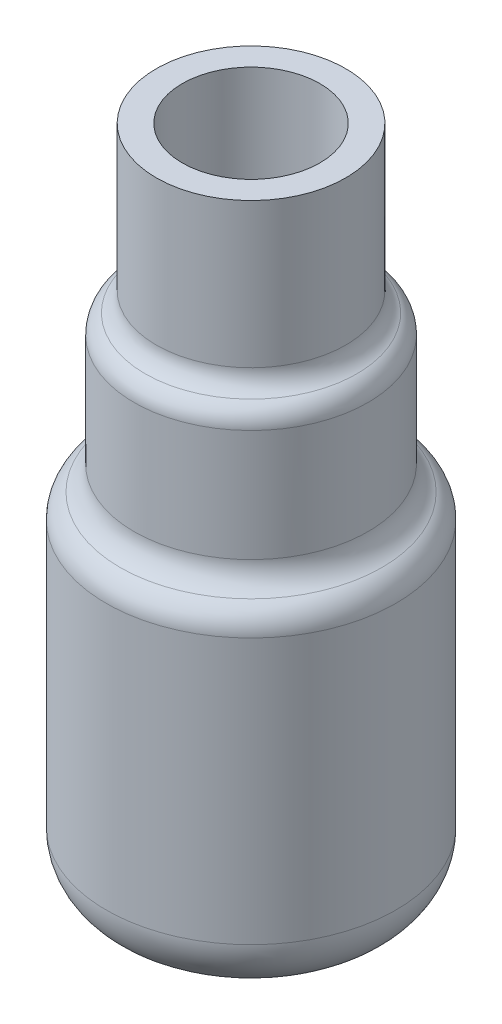
ISO-10303-21;
HEADER;
FILE_DESCRIPTION(('STEP AP214'),'2;1');
FILE_NAME('part.step','',(''),(''),'','','');
FILE_SCHEMA(('AUTOMOTIVE_DESIGN { 1 0 10303 214 1 1 1 1 }'));
ENDSEC;
DATA;
#1=APPLICATION_CONTEXT('core data for automotive mechanical design processes');
#2=APPLICATION_PROTOCOL_DEFINITION('international standard','automotive_design',2000,#1);
#3=PRODUCT_CONTEXT('',#1,'mechanical');
#4=PRODUCT('Part','Part','',(#3));
#5=PRODUCT_RELATED_PRODUCT_CATEGORY('part','',(#4));
#6=PRODUCT_DEFINITION_FORMATION('','',#4);
#7=PRODUCT_DEFINITION_CONTEXT('part definition',#1,'design');
#8=PRODUCT_DEFINITION('design','',#6,#7);
#9=PRODUCT_DEFINITION_SHAPE('','',#8);
#10=(LENGTH_UNIT() NAMED_UNIT(*) SI_UNIT(.MILLI.,.METRE.));
#11=(NAMED_UNIT(*) PLANE_ANGLE_UNIT() SI_UNIT($,.RADIAN.));
#12=(NAMED_UNIT(*) SI_UNIT($,.STERADIAN.) SOLID_ANGLE_UNIT());
#13=UNCERTAINTY_MEASURE_WITH_UNIT(LENGTH_MEASURE(1.E-05),#10,'distance_accuracy_value','');
#14=(GEOMETRIC_REPRESENTATION_CONTEXT(3) GLOBAL_UNCERTAINTY_ASSIGNED_CONTEXT((#13)) GLOBAL_UNIT_ASSIGNED_CONTEXT((#10,
#11,#12)) REPRESENTATION_CONTEXT('',''));
#15=CARTESIAN_POINT('',(0.,0.,0.));
#16=DIRECTION('',(0.,0.,1.));
#17=DIRECTION('',(1.,0.,0.));
#18=AXIS2_PLACEMENT_3D('',#15,#16,#17);
#19=CARTESIAN_POINT('',(0.,60.,0.));
#20=DIRECTION('',(0.,-1.,0.));
#21=DIRECTION('',(0.,0.,-1.));
#22=AXIS2_PLACEMENT_3D('',#19,#20,#21);
#23=CYLINDRICAL_SURFACE('',#22,21.);
#24=CARTESIAN_POINT('',(0.,53.,0.));
#25=DIRECTION('',(0.,1.,0.));
#26=DIRECTION('',(0.,0.,1.));
#27=AXIS2_PLACEMENT_3D('',#24,#25,#26);
#28=CIRCLE('',#27,21.);
#29=CARTESIAN_POINT('',(0.,53.,21.));
#30=VERTEX_POINT('',#29);
#31=EDGE_CURVE('E40',#30,#30,#28,.T.);
#32=ORIENTED_EDGE('',*,*,#31,.T.);
#33=EDGE_LOOP('',(#32));
#34=FACE_BOUND('',#33,.T.);
#35=CARTESIAN_POINT('',(0.,0.,0.));
#36=DIRECTION('',(0.,1.,0.));
#37=DIRECTION('',(0.,0.,1.));
#38=AXIS2_PLACEMENT_3D('',#35,#36,#37);
#39=CIRCLE('',#38,21.);
#40=CARTESIAN_POINT('',(0.,0.,21.));
#41=VERTEX_POINT('',#40);
#42=EDGE_CURVE('E67',#41,#41,#39,.T.);
#43=ORIENTED_EDGE('',*,*,#42,.F.);
#44=EDGE_LOOP('',(#43));
#45=FACE_BOUND('',#44,.T.);
#46=ADVANCED_FACE('F29',(#34,#45),#23,.F.);
#47=CARTESIAN_POINT('',(0.,60.,0.));
#48=DIRECTION('',(0.,-1.,0.));
#49=DIRECTION('',(0.,0.,-1.));
#50=AXIS2_PLACEMENT_3D('',#47,#48,#49);
#51=CYLINDRICAL_SURFACE('',#50,26.);
#52=CARTESIAN_POINT('',(0.,56.3397459621556,0.));
#53=DIRECTION('',(0.,-1.,0.));
#54=DIRECTION('',(0.,0.,-1.));
#55=AXIS2_PLACEMENT_3D('',#52,#53,#54);
#56=CIRCLE('',#55,26.);
#57=CARTESIAN_POINT('',(0.,56.3397459621556,-26.));
#58=VERTEX_POINT('',#57);
#59=EDGE_CURVE('E44',#58,#58,#56,.T.);
#60=ORIENTED_EDGE('',*,*,#59,.T.);
#61=EDGE_LOOP('',(#60));
#62=FACE_BOUND('',#61,.T.);
#63=CARTESIAN_POINT('',(0.,8.66025403784439,0.));
#64=DIRECTION('',(0.,-1.,0.));
#65=DIRECTION('',(0.,0.,-1.));
#66=AXIS2_PLACEMENT_3D('',#63,#64,#65);
#67=CIRCLE('',#66,26.);
#68=CARTESIAN_POINT('',(0.,8.66025403784439,-26.));
#69=VERTEX_POINT('',#68);
#70=EDGE_CURVE('E64',#69,#69,#67,.F.);
#71=ORIENTED_EDGE('',*,*,#70,.T.);
#72=EDGE_LOOP('',(#71));
#73=FACE_BOUND('',#72,.T.);
#74=ADVANCED_FACE('F94',(#62,#73),#51,.T.);
#75=CARTESIAN_POINT('',(0.,8.66025403784439,0.));
#76=DIRECTION('',(0.,-1.,0.));
#77=DIRECTION('',(0.,0.,-1.));
#78=AXIS2_PLACEMENT_3D('',#75,#76,#77);
#79=TOROIDAL_SURFACE('',#78,16.,10.);
#80=ORIENTED_EDGE('',*,*,#42,.T.);
#81=EDGE_LOOP('',(#80));
#82=FACE_BOUND('',#81,.T.);
#83=ORIENTED_EDGE('',*,*,#70,.F.);
#84=EDGE_LOOP('',(#83));
#85=FACE_BOUND('',#84,.T.);
#86=ADVANCED_FACE('F100',(#82,#85),#79,.T.);
#87=CARTESIAN_POINT('',(0.,88.,0.));
#88=DIRECTION('',(0.,-1.,0.));
#89=DIRECTION('',(0.,0.,-1.));
#90=AXIS2_PLACEMENT_3D('',#87,#88,#89);
#91=CYLINDRICAL_SURFACE('',#90,21.);
#92=CARTESIAN_POINT('',(0.,65.,0.));
#93=DIRECTION('',(0.,1.,0.));
#94=DIRECTION('',(0.,0.,1.));
#95=AXIS2_PLACEMENT_3D('',#92,#93,#94);
#96=CIRCLE('',#95,21.);
#97=CARTESIAN_POINT('',(0.,65.,21.));
#98=VERTEX_POINT('',#97);
#99=EDGE_CURVE('E52',#98,#98,#96,.T.);
#100=ORIENTED_EDGE('',*,*,#99,.T.);
#101=EDGE_LOOP('',(#100));
#102=FACE_BOUND('',#101,.T.);
#103=CARTESIAN_POINT('',(0.,85.0717967697245,0.));
#104=DIRECTION('',(0.,-1.,0.));
#105=DIRECTION('',(0.,0.,-1.));
#106=AXIS2_PLACEMENT_3D('',#103,#104,#105);
#107=CIRCLE('',#106,21.);
#108=CARTESIAN_POINT('',(0.,85.0717967697245,-21.));
#109=VERTEX_POINT('',#108);
#110=EDGE_CURVE('E55',#109,#109,#107,.T.);
#111=ORIENTED_EDGE('',*,*,#110,.T.);
#112=EDGE_LOOP('',(#111));
#113=FACE_BOUND('',#112,.T.);
#114=ADVANCED_FACE('F91',(#102,#113),#91,.T.);
#115=CARTESIAN_POINT('',(0.,88.,0.));
#116=DIRECTION('',(0.,-1.,0.));
#117=DIRECTION('',(0.,0.,-1.));
#118=AXIS2_PLACEMENT_3D('',#115,#116,#117);
#119=CYLINDRICAL_SURFACE('',#118,12.35);
#120=CARTESIAN_POINT('',(0.,62.9084559846628,0.));
#121=DIRECTION('',(0.,-1.,0.));
#122=DIRECTION('',(0.,0.,-1.));
#123=AXIS2_PLACEMENT_3D('',#120,#121,#122);
#124=CIRCLE('',#123,12.35);
#125=CARTESIAN_POINT('',(0.,62.9084559846628,-12.35));
#126=VERTEX_POINT('',#125);
#127=EDGE_CURVE('E10',#126,#126,#124,.T.);
#128=ORIENTED_EDGE('',*,*,#127,.T.);
#129=EDGE_LOOP('',(#128));
#130=FACE_BOUND('',#129,.T.);
#131=CARTESIAN_POINT('',(0.,118.,0.));
#132=DIRECTION('',(0.,1.,0.));
#133=DIRECTION('',(0.,0.,1.));
#134=AXIS2_PLACEMENT_3D('',#131,#132,#133);
#135=CIRCLE('',#134,12.35);
#136=CARTESIAN_POINT('',(0.,118.,12.35));
#137=VERTEX_POINT('',#136);
#138=EDGE_CURVE('E73',#137,#137,#135,.T.);
#139=ORIENTED_EDGE('',*,*,#138,.T.);
#140=EDGE_LOOP('',(#139));
#141=FACE_BOUND('',#140,.T.);
#142=ADVANCED_FACE('F77',(#130,#141),#119,.F.);
#143=CARTESIAN_POINT('',(0.,118.,0.));
#144=DIRECTION('',(0.,1.,0.));
#145=DIRECTION('',(0.,0.,1.));
#146=AXIS2_PLACEMENT_3D('',#143,#144,#145);
#147=PLANE('',#146);
#148=CARTESIAN_POINT('',(0.,118.,0.));
#149=DIRECTION('',(0.,1.,0.));
#150=DIRECTION('',(0.,0.,1.));
#151=AXIS2_PLACEMENT_3D('',#148,#149,#150);
#152=CIRCLE('',#151,17.);
#153=CARTESIAN_POINT('',(0.,118.,17.));
#154=VERTEX_POINT('',#153);
#155=EDGE_CURVE('E70',#154,#154,#152,.T.);
#156=ORIENTED_EDGE('',*,*,#155,.T.);
#157=EDGE_LOOP('',(#156));
#158=FACE_BOUND('',#157,.T.);
#159=ORIENTED_EDGE('',*,*,#138,.F.);
#160=EDGE_LOOP('',(#159));
#161=FACE_BOUND('',#160,.T.);
#162=ADVANCED_FACE('F79',(#158,#161),#147,.T.);
#163=CARTESIAN_POINT('',(0.,118.,0.));
#164=DIRECTION('',(0.,-1.,0.));
#165=DIRECTION('',(0.,0.,-1.));
#166=AXIS2_PLACEMENT_3D('',#163,#164,#165);
#167=CYLINDRICAL_SURFACE('',#166,17.);
#168=CARTESIAN_POINT('',(0.,92.,0.));
#169=DIRECTION('',(0.,1.,0.));
#170=DIRECTION('',(0.,0.,1.));
#171=AXIS2_PLACEMENT_3D('',#168,#169,#170);
#172=CIRCLE('',#171,17.);
#173=CARTESIAN_POINT('',(0.,92.,17.));
#174=VERTEX_POINT('',#173);
#175=EDGE_CURVE('E61',#174,#174,#172,.T.);
#176=ORIENTED_EDGE('',*,*,#175,.T.);
#177=EDGE_LOOP('',(#176));
#178=FACE_BOUND('',#177,.T.);
#179=ORIENTED_EDGE('',*,*,#155,.F.);
#180=EDGE_LOOP('',(#179));
#181=FACE_BOUND('',#180,.T.);
#182=ADVANCED_FACE('F81',(#178,#181),#167,.T.);
#183=CARTESIAN_POINT('',(0.,92.,0.));
#184=DIRECTION('',(0.,1.,0.));
#185=DIRECTION('',(0.,0.,1.));
#186=AXIS2_PLACEMENT_3D('',#183,#184,#185);
#187=TOROIDAL_SURFACE('',#186,21.,4.);
#188=CARTESIAN_POINT('',(0.,88.5358983848623,0.));
#189=DIRECTION('',(0.,1.,0.));
#190=DIRECTION('',(0.,0.,1.));
#191=AXIS2_PLACEMENT_3D('',#188,#189,#190);
#192=CIRCLE('',#191,19.);
#193=CARTESIAN_POINT('',(0.,88.5358983848623,19.));
#194=VERTEX_POINT('',#193);
#195=EDGE_CURVE('E58',#194,#194,#192,.T.);
#196=ORIENTED_EDGE('',*,*,#195,.T.);
#197=EDGE_LOOP('',(#196));
#198=FACE_BOUND('',#197,.T.);
#199=ORIENTED_EDGE('',*,*,#175,.F.);
#200=EDGE_LOOP('',(#199));
#201=FACE_BOUND('',#200,.T.);
#202=ADVANCED_FACE('F88',(#198,#201),#187,.F.);
#203=CARTESIAN_POINT('',(0.,85.0717967697245,0.));
#204=DIRECTION('',(0.,-1.,0.));
#205=DIRECTION('',(0.,0.,-1.));
#206=AXIS2_PLACEMENT_3D('',#203,#204,#205);
#207=TOROIDAL_SURFACE('',#206,17.,4.);
#208=ORIENTED_EDGE('',*,*,#110,.F.);
#209=EDGE_LOOP('',(#208));
#210=FACE_BOUND('',#209,.T.);
#211=ORIENTED_EDGE('',*,*,#195,.F.);
#212=EDGE_LOOP('',(#211));
#213=FACE_BOUND('',#212,.T.);
#214=ADVANCED_FACE('F111',(#210,#213),#207,.T.);
#215=CARTESIAN_POINT('',(0.,65.,0.));
#216=DIRECTION('',(0.,1.,0.));
#217=DIRECTION('',(0.,0.,1.));
#218=AXIS2_PLACEMENT_3D('',#215,#216,#217);
#219=TOROIDAL_SURFACE('',#218,26.,5.);
#220=CARTESIAN_POINT('',(0.,60.6698729810778,0.));
#221=DIRECTION('',(0.,1.,0.));
#222=DIRECTION('',(0.,0.,1.));
#223=AXIS2_PLACEMENT_3D('',#220,#221,#222);
#224=CIRCLE('',#223,23.5);
#225=CARTESIAN_POINT('',(0.,60.6698729810778,23.5));
#226=VERTEX_POINT('',#225);
#227=EDGE_CURVE('E49',#226,#226,#224,.T.);
#228=ORIENTED_EDGE('',*,*,#227,.T.);
#229=EDGE_LOOP('',(#228));
#230=FACE_BOUND('',#229,.T.);
#231=ORIENTED_EDGE('',*,*,#99,.F.);
#232=EDGE_LOOP('',(#231));
#233=FACE_BOUND('',#232,.T.);
#234=ADVANCED_FACE('F115',(#230,#233),#219,.F.);
#235=CARTESIAN_POINT('',(0.,56.3397459621556,0.));
#236=DIRECTION('',(0.,-1.,0.));
#237=DIRECTION('',(0.,0.,-1.));
#238=AXIS2_PLACEMENT_3D('',#235,#236,#237);
#239=TOROIDAL_SURFACE('',#238,21.,5.);
#240=ORIENTED_EDGE('',*,*,#59,.F.);
#241=EDGE_LOOP('',(#240));
#242=FACE_BOUND('',#241,.T.);
#243=ORIENTED_EDGE('',*,*,#227,.F.);
#244=EDGE_LOOP('',(#243));
#245=FACE_BOUND('',#244,.T.);
#246=ADVANCED_FACE('F119',(#242,#245),#239,.T.);
#247=CARTESIAN_POINT('',(0.,53.,0.));
#248=DIRECTION('',(0.,1.,0.));
#249=DIRECTION('',(0.,0.,1.));
#250=AXIS2_PLACEMENT_3D('',#247,#248,#249);
#251=TOROIDAL_SURFACE('',#250,16.,5.);
#252=CARTESIAN_POINT('',(0.,57.9542279923317,0.));
#253=DIRECTION('',(0.,-1.,0.));
#254=DIRECTION('',(0.,0.,-1.));
#255=AXIS2_PLACEMENT_3D('',#252,#253,#254);
#256=CIRCLE('',#255,16.675);
#257=CARTESIAN_POINT('',(0.,57.9542279923317,-16.675));
#258=VERTEX_POINT('',#257);
#259=EDGE_CURVE('E36',#258,#258,#256,.F.);
#260=ORIENTED_EDGE('',*,*,#259,.T.);
#261=EDGE_LOOP('',(#260));
#262=FACE_BOUND('',#261,.T.);
#263=ORIENTED_EDGE('',*,*,#31,.F.);
#264=EDGE_LOOP('',(#263));
#265=FACE_BOUND('',#264,.T.);
#266=ADVANCED_FACE('F122',(#262,#265),#251,.F.);
#267=CARTESIAN_POINT('',(0.,62.9084559846628,0.));
#268=DIRECTION('',(0.,-1.,0.));
#269=DIRECTION('',(0.,0.,-1.));
#270=AXIS2_PLACEMENT_3D('',#267,#268,#269);
#271=TOROIDAL_SURFACE('',#270,17.35,5.);
#272=ORIENTED_EDGE('',*,*,#127,.F.);
#273=EDGE_LOOP('',(#272));
#274=FACE_BOUND('',#273,.T.);
#275=ORIENTED_EDGE('',*,*,#259,.F.);
#276=EDGE_LOOP('',(#275));
#277=FACE_BOUND('',#276,.T.);
#278=ADVANCED_FACE('F31',(#274,#277),#271,.T.);
#279=CLOSED_SHELL('',(#46,#74,#86,#114,#142,#162,#182,#202,#214,#234,#246,#266,#278));
#280=MANIFOLD_SOLID_BREP('B2',#279);
#281=ADVANCED_BREP_SHAPE_REPRESENTATION('',(#18,#280),#14);
#282=SHAPE_DEFINITION_REPRESENTATION(#9,#281);
ENDSEC;
END-ISO-10303-21;
